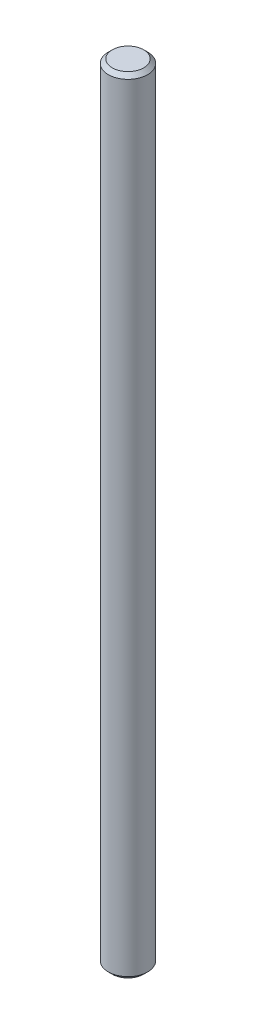
ISO-10303-21;
HEADER;
FILE_DESCRIPTION(('STEP AP214'),'2;1');
FILE_NAME('part.step','',(''),(''),'','','');
FILE_SCHEMA(('AUTOMOTIVE_DESIGN { 1 0 10303 214 1 1 1 1 }'));
ENDSEC;
DATA;
#1=APPLICATION_CONTEXT('core data for automotive mechanical design processes');
#2=APPLICATION_PROTOCOL_DEFINITION('international standard','automotive_design',2000,#1);
#3=PRODUCT_CONTEXT('',#1,'mechanical');
#4=PRODUCT('Part','Part','',(#3));
#5=PRODUCT_RELATED_PRODUCT_CATEGORY('part','',(#4));
#6=PRODUCT_DEFINITION_FORMATION('','',#4);
#7=PRODUCT_DEFINITION_CONTEXT('part definition',#1,'design');
#8=PRODUCT_DEFINITION('design','',#6,#7);
#9=PRODUCT_DEFINITION_SHAPE('','',#8);
#10=(LENGTH_UNIT() NAMED_UNIT(*) SI_UNIT(.MILLI.,.METRE.));
#11=(NAMED_UNIT(*) PLANE_ANGLE_UNIT() SI_UNIT($,.RADIAN.));
#12=(NAMED_UNIT(*) SI_UNIT($,.STERADIAN.) SOLID_ANGLE_UNIT());
#13=UNCERTAINTY_MEASURE_WITH_UNIT(LENGTH_MEASURE(1.E-05),#10,'distance_accuracy_value','');
#14=(GEOMETRIC_REPRESENTATION_CONTEXT(3) GLOBAL_UNCERTAINTY_ASSIGNED_CONTEXT((#13)) GLOBAL_UNIT_ASSIGNED_CONTEXT((#10,
#11,#12)) REPRESENTATION_CONTEXT('',''));
#15=CARTESIAN_POINT('',(0.,0.,0.));
#16=DIRECTION('',(0.,0.,1.));
#17=DIRECTION('',(1.,0.,0.));
#18=AXIS2_PLACEMENT_3D('',#15,#16,#17);
#19=CARTESIAN_POINT('',(0.,160.,0.));
#20=DIRECTION('',(0.,-1.,0.));
#21=DIRECTION('',(0.,0.,-1.));
#22=AXIS2_PLACEMENT_3D('',#19,#20,#21);
#23=CYLINDRICAL_SURFACE('',#22,4.);
#24=CARTESIAN_POINT('',(0.,0.799999999999995,0.));
#25=DIRECTION('',(0.,1.,0.));
#26=DIRECTION('',(0.,0.,1.));
#27=AXIS2_PLACEMENT_3D('',#24,#25,#26);
#28=CIRCLE('',#27,4.);
#29=CARTESIAN_POINT('',(0.,0.799999999999995,4.));
#30=VERTEX_POINT('',#29);
#31=EDGE_CURVE('E42',#30,#30,#28,.T.);
#32=ORIENTED_EDGE('',*,*,#31,.T.);
#33=EDGE_LOOP('',(#32));
#34=FACE_BOUND('',#33,.T.);
#35=CARTESIAN_POINT('',(0.,159.2,0.));
#36=DIRECTION('',(0.,1.,0.));
#37=DIRECTION('',(0.,0.,1.));
#38=AXIS2_PLACEMENT_3D('',#35,#36,#37);
#39=CIRCLE('',#38,4.);
#40=CARTESIAN_POINT('',(0.,159.2,4.));
#41=VERTEX_POINT('',#40);
#42=EDGE_CURVE('E46',#41,#41,#39,.F.);
#43=ORIENTED_EDGE('',*,*,#42,.T.);
#44=EDGE_LOOP('',(#43));
#45=FACE_BOUND('',#44,.T.);
#46=ADVANCED_FACE('F31',(#34,#45),#23,.T.);
#47=CARTESIAN_POINT('',(0.,160.,0.));
#48=DIRECTION('',(0.,1.,0.));
#49=DIRECTION('',(0.,0.,1.));
#50=AXIS2_PLACEMENT_3D('',#47,#48,#49);
#51=PLANE('',#50);
#52=CARTESIAN_POINT('',(0.,160.,0.));
#53=DIRECTION('',(0.,1.,0.));
#54=DIRECTION('',(0.,0.,1.));
#55=AXIS2_PLACEMENT_3D('',#52,#53,#54);
#56=CIRCLE('',#55,3.20000000000005);
#57=CARTESIAN_POINT('',(0.,160.,3.20000000000005));
#58=VERTEX_POINT('',#57);
#59=EDGE_CURVE('E10',#58,#58,#56,.T.);
#60=ORIENTED_EDGE('',*,*,#59,.T.);
#61=EDGE_LOOP('',(#60));
#62=FACE_BOUND('',#61,.T.);
#63=ADVANCED_FACE('F62',(#62),#51,.T.);
#64=CARTESIAN_POINT('',(0.,0.,0.));
#65=DIRECTION('',(0.,1.,0.));
#66=DIRECTION('',(0.,0.,1.));
#67=AXIS2_PLACEMENT_3D('',#64,#65,#66);
#68=PLANE('',#67);
#69=CARTESIAN_POINT('',(0.,0.,0.));
#70=DIRECTION('',(0.,1.,0.));
#71=DIRECTION('',(0.,0.,1.));
#72=AXIS2_PLACEMENT_3D('',#69,#70,#71);
#73=CIRCLE('',#72,3.19999999999998);
#74=CARTESIAN_POINT('',(0.,0.,3.19999999999998));
#75=VERTEX_POINT('',#74);
#76=EDGE_CURVE('E38',#75,#75,#73,.F.);
#77=ORIENTED_EDGE('',*,*,#76,.T.);
#78=EDGE_LOOP('',(#77));
#79=FACE_BOUND('',#78,.T.);
#80=ADVANCED_FACE('F59',(#79),#68,.F.);
#81=CARTESIAN_POINT('',(0.,0.799999999999995,0.));
#82=DIRECTION('',(0.,1.,0.));
#83=DIRECTION('',(0.,0.,1.));
#84=AXIS2_PLACEMENT_3D('',#81,#82,#83);
#85=CONICAL_SURFACE('',#84,4.,0.785398163397463);
#86=ORIENTED_EDGE('',*,*,#76,.F.);
#87=EDGE_LOOP('',(#86));
#88=FACE_BOUND('',#87,.T.);
#89=ORIENTED_EDGE('',*,*,#31,.F.);
#90=EDGE_LOOP('',(#89));
#91=FACE_BOUND('',#90,.T.);
#92=ADVANCED_FACE('F55',(#88,#91),#85,.T.);
#93=CARTESIAN_POINT('',(0.,160.,0.));
#94=DIRECTION('',(0.,-1.,0.));
#95=DIRECTION('',(0.,0.,-1.));
#96=AXIS2_PLACEMENT_3D('',#93,#94,#95);
#97=CONICAL_SURFACE('',#96,3.20000000000005,0.785398163397455);
#98=ORIENTED_EDGE('',*,*,#42,.F.);
#99=EDGE_LOOP('',(#98));
#100=FACE_BOUND('',#99,.T.);
#101=ORIENTED_EDGE('',*,*,#59,.F.);
#102=EDGE_LOOP('',(#101));
#103=FACE_BOUND('',#102,.T.);
#104=ADVANCED_FACE('F33',(#100,#103),#97,.T.);
#105=CLOSED_SHELL('',(#46,#63,#80,#92,#104));
#106=MANIFOLD_SOLID_BREP('B2',#105);
#107=ADVANCED_BREP_SHAPE_REPRESENTATION('',(#18,#106),#14);
#108=SHAPE_DEFINITION_REPRESENTATION(#9,#107);
ENDSEC;
END-ISO-10303-21;
